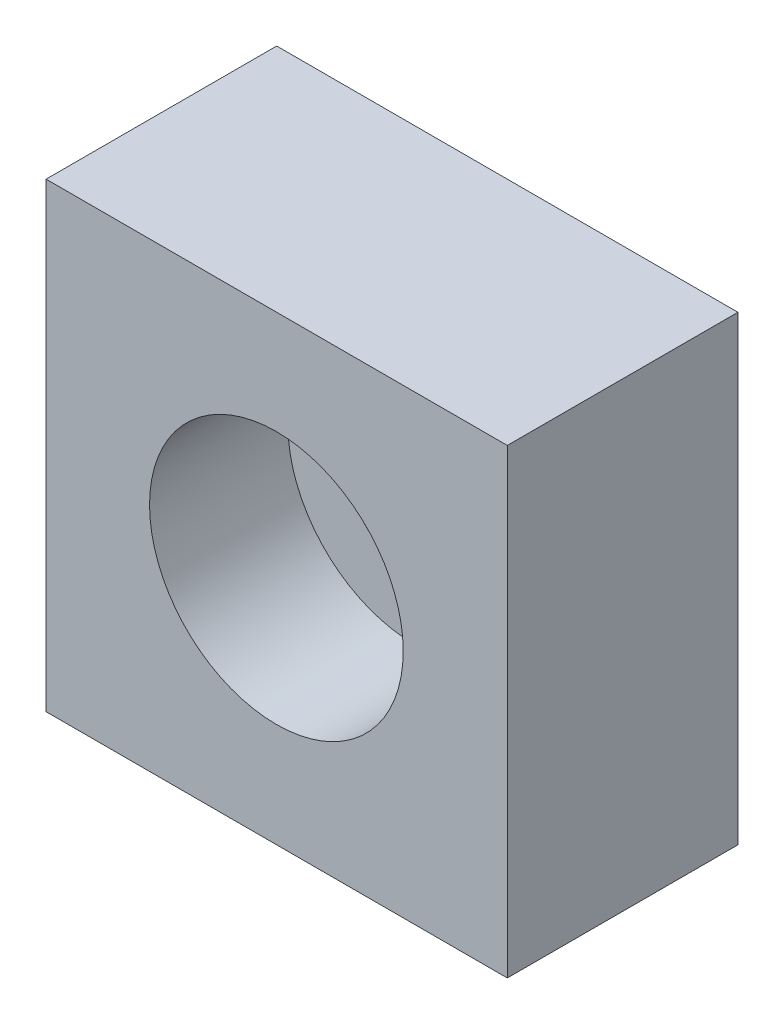
ISO-10303-21;
HEADER;
FILE_DESCRIPTION(('STEP AP214'),'2;1');
FILE_NAME('part.step','',(''),(''),'','','');
FILE_SCHEMA(('AUTOMOTIVE_DESIGN { 1 0 10303 214 1 1 1 1 }'));
ENDSEC;
DATA;
#1=APPLICATION_CONTEXT('core data for automotive mechanical design processes');
#2=APPLICATION_PROTOCOL_DEFINITION('international standard','automotive_design',2000,#1);
#3=PRODUCT_CONTEXT('',#1,'mechanical');
#4=PRODUCT('Part','Part','',(#3));
#5=PRODUCT_RELATED_PRODUCT_CATEGORY('part','',(#4));
#6=PRODUCT_DEFINITION_FORMATION('','',#4);
#7=PRODUCT_DEFINITION_CONTEXT('part definition',#1,'design');
#8=PRODUCT_DEFINITION('design','',#6,#7);
#9=PRODUCT_DEFINITION_SHAPE('','',#8);
#10=(LENGTH_UNIT() NAMED_UNIT(*) SI_UNIT(.MILLI.,.METRE.));
#11=(NAMED_UNIT(*) PLANE_ANGLE_UNIT() SI_UNIT($,.RADIAN.));
#12=(NAMED_UNIT(*) SI_UNIT($,.STERADIAN.) SOLID_ANGLE_UNIT());
#13=UNCERTAINTY_MEASURE_WITH_UNIT(LENGTH_MEASURE(1.E-05),#10,'distance_accuracy_value','');
#14=(GEOMETRIC_REPRESENTATION_CONTEXT(3) GLOBAL_UNCERTAINTY_ASSIGNED_CONTEXT((#13)) GLOBAL_UNIT_ASSIGNED_CONTEXT((#10,
#11,#12)) REPRESENTATION_CONTEXT('',''));
#15=CARTESIAN_POINT('',(0.,0.,0.));
#16=DIRECTION('',(0.,0.,1.));
#17=DIRECTION('',(1.,0.,0.));
#18=AXIS2_PLACEMENT_3D('',#15,#16,#17);
#19=CARTESIAN_POINT('',(0.,0.,10.));
#20=DIRECTION('',(1.,0.,0.));
#21=DIRECTION('',(0.,0.,-1.));
#22=AXIS2_PLACEMENT_3D('',#19,#20,#21);
#23=PLANE('',#22);
#24=DIRECTION('',(0.,-1.,0.));
#25=VECTOR('',#24,1.);
#26=CARTESIAN_POINT('',(0.,0.,0.));
#27=LINE('',#26,#25);
#28=CARTESIAN_POINT('',(0.,20.,0.));
#29=VERTEX_POINT('',#28);
#30=CARTESIAN_POINT('',(0.,0.,0.));
#31=VERTEX_POINT('',#30);
#32=EDGE_CURVE('E105',#29,#31,#27,.T.);
#33=ORIENTED_EDGE('',*,*,#32,.T.);
#34=DIRECTION('',(0.,0.,-1.));
#35=VECTOR('',#34,1.);
#36=CARTESIAN_POINT('',(0.,0.,10.));
#37=LINE('',#36,#35);
#38=CARTESIAN_POINT('',(0.,0.,10.));
#39=VERTEX_POINT('',#38);
#40=EDGE_CURVE('E11',#39,#31,#37,.T.);
#41=ORIENTED_EDGE('',*,*,#40,.F.);
#42=DIRECTION('',(0.,-1.,0.));
#43=VECTOR('',#42,1.);
#44=CARTESIAN_POINT('',(0.,0.,10.));
#45=LINE('',#44,#43);
#46=CARTESIAN_POINT('',(0.,20.,10.));
#47=VERTEX_POINT('',#46);
#48=EDGE_CURVE('E89',#47,#39,#45,.T.);
#49=ORIENTED_EDGE('',*,*,#48,.F.);
#50=DIRECTION('',(0.,0.,-1.));
#51=VECTOR('',#50,1.);
#52=CARTESIAN_POINT('',(0.,20.,10.));
#53=LINE('',#52,#51);
#54=EDGE_CURVE('E98',#47,#29,#53,.T.);
#55=ORIENTED_EDGE('',*,*,#54,.T.);
#56=EDGE_LOOP('',(#33,#41,#49,#55));
#57=FACE_BOUND('',#56,.T.);
#58=ADVANCED_FACE('F39',(#57),#23,.F.);
#59=CARTESIAN_POINT('',(0.,0.,10.));
#60=DIRECTION('',(0.,1.,0.));
#61=DIRECTION('',(0.,0.,1.));
#62=AXIS2_PLACEMENT_3D('',#59,#60,#61);
#63=PLANE('',#62);
#64=DIRECTION('',(1.,0.,0.));
#65=VECTOR('',#64,1.);
#66=CARTESIAN_POINT('',(0.,0.,0.));
#67=LINE('',#66,#65);
#68=CARTESIAN_POINT('',(20.,0.,0.));
#69=VERTEX_POINT('',#68);
#70=EDGE_CURVE('E94',#31,#69,#67,.T.);
#71=ORIENTED_EDGE('',*,*,#70,.T.);
#72=DIRECTION('',(0.,0.,-1.));
#73=VECTOR('',#72,1.);
#74=CARTESIAN_POINT('',(20.,0.,10.));
#75=LINE('',#74,#73);
#76=CARTESIAN_POINT('',(20.,0.,10.));
#77=VERTEX_POINT('',#76);
#78=EDGE_CURVE('E50',#77,#69,#75,.T.);
#79=ORIENTED_EDGE('',*,*,#78,.F.);
#80=DIRECTION('',(1.,0.,0.));
#81=VECTOR('',#80,1.);
#82=CARTESIAN_POINT('',(0.,0.,10.));
#83=LINE('',#82,#81);
#84=EDGE_CURVE('E84',#39,#77,#83,.T.);
#85=ORIENTED_EDGE('',*,*,#84,.F.);
#86=ORIENTED_EDGE('',*,*,#40,.T.);
#87=EDGE_LOOP('',(#71,#79,#85,#86));
#88=FACE_BOUND('',#87,.T.);
#89=ADVANCED_FACE('F91',(#88),#63,.F.);
#90=CARTESIAN_POINT('',(20.,0.,10.));
#91=DIRECTION('',(-1.,0.,0.));
#92=DIRECTION('',(0.,0.,1.));
#93=AXIS2_PLACEMENT_3D('',#90,#91,#92);
#94=PLANE('',#93);
#95=DIRECTION('',(0.,1.,0.));
#96=VECTOR('',#95,1.);
#97=CARTESIAN_POINT('',(20.,0.,0.));
#98=LINE('',#97,#96);
#99=CARTESIAN_POINT('',(20.,20.,0.));
#100=VERTEX_POINT('',#99);
#101=EDGE_CURVE('E75',#69,#100,#98,.T.);
#102=ORIENTED_EDGE('',*,*,#101,.T.);
#103=DIRECTION('',(0.,0.,-1.));
#104=VECTOR('',#103,1.);
#105=CARTESIAN_POINT('',(20.,20.,10.));
#106=LINE('',#105,#104);
#107=CARTESIAN_POINT('',(20.,20.,10.));
#108=VERTEX_POINT('',#107);
#109=EDGE_CURVE('E92',#108,#100,#106,.T.);
#110=ORIENTED_EDGE('',*,*,#109,.F.);
#111=DIRECTION('',(0.,1.,0.));
#112=VECTOR('',#111,1.);
#113=CARTESIAN_POINT('',(20.,0.,10.));
#114=LINE('',#113,#112);
#115=EDGE_CURVE('E86',#77,#108,#114,.T.);
#116=ORIENTED_EDGE('',*,*,#115,.F.);
#117=ORIENTED_EDGE('',*,*,#78,.T.);
#118=EDGE_LOOP('',(#102,#110,#116,#117));
#119=FACE_BOUND('',#118,.T.);
#120=ADVANCED_FACE('F96',(#119),#94,.F.);
#121=CARTESIAN_POINT('',(0.,20.,10.));
#122=DIRECTION('',(0.,-1.,0.));
#123=DIRECTION('',(0.,0.,-1.));
#124=AXIS2_PLACEMENT_3D('',#121,#122,#123);
#125=PLANE('',#124);
#126=DIRECTION('',(-1.,0.,0.));
#127=VECTOR('',#126,1.);
#128=CARTESIAN_POINT('',(0.,20.,0.));
#129=LINE('',#128,#127);
#130=EDGE_CURVE('E79',#100,#29,#129,.T.);
#131=ORIENTED_EDGE('',*,*,#130,.T.);
#132=ORIENTED_EDGE('',*,*,#54,.F.);
#133=DIRECTION('',(-1.,0.,0.));
#134=VECTOR('',#133,1.);
#135=CARTESIAN_POINT('',(0.,20.,10.));
#136=LINE('',#135,#134);
#137=EDGE_CURVE('E54',#108,#47,#136,.T.);
#138=ORIENTED_EDGE('',*,*,#137,.F.);
#139=ORIENTED_EDGE('',*,*,#109,.T.);
#140=EDGE_LOOP('',(#131,#132,#138,#139));
#141=FACE_BOUND('',#140,.T.);
#142=ADVANCED_FACE('F109',(#141),#125,.F.);
#143=CARTESIAN_POINT('',(0.,0.,10.));
#144=DIRECTION('',(0.,0.,-1.));
#145=DIRECTION('',(-1.,0.,0.));
#146=AXIS2_PLACEMENT_3D('',#143,#144,#145);
#147=PLANE('',#146);
#148=CARTESIAN_POINT('',(9.98648737498797,10.0143055988724,10.));
#149=DIRECTION('',(0.,0.,1.));
#150=DIRECTION('',(1.,0.,0.));
#151=AXIS2_PLACEMENT_3D('',#148,#149,#150);
#152=CIRCLE('',#151,5.49999999999999);
#153=CARTESIAN_POINT('',(15.486487374988,10.0143055988724,10.));
#154=VERTEX_POINT('',#153);
#155=EDGE_CURVE('E123',#154,#154,#152,.T.);
#156=ORIENTED_EDGE('',*,*,#155,.F.);
#157=EDGE_LOOP('',(#156));
#158=FACE_BOUND('',#157,.T.);
#159=ORIENTED_EDGE('',*,*,#48,.T.);
#160=ORIENTED_EDGE('',*,*,#84,.T.);
#161=ORIENTED_EDGE('',*,*,#115,.T.);
#162=ORIENTED_EDGE('',*,*,#137,.T.);
#163=EDGE_LOOP('',(#159,#160,#161,#162));
#164=FACE_BOUND('',#163,.T.);
#165=ADVANCED_FACE('F88',(#158,#164),#147,.F.);
#166=CARTESIAN_POINT('',(0.,0.,0.));
#167=DIRECTION('',(0.,0.,-1.));
#168=DIRECTION('',(-1.,0.,0.));
#169=AXIS2_PLACEMENT_3D('',#166,#167,#168);
#170=PLANE('',#169);
#171=CARTESIAN_POINT('',(9.98648737498797,10.0143055988724,0.));
#172=DIRECTION('',(0.,0.,1.));
#173=DIRECTION('',(1.,0.,0.));
#174=AXIS2_PLACEMENT_3D('',#171,#172,#173);
#175=CIRCLE('',#174,3.00000000000001);
#176=CARTESIAN_POINT('',(12.986487374988,10.0143055988724,0.));
#177=VERTEX_POINT('',#176);
#178=EDGE_CURVE('E104',#177,#177,#175,.T.);
#179=ORIENTED_EDGE('',*,*,#178,.T.);
#180=EDGE_LOOP('',(#179));
#181=FACE_BOUND('',#180,.T.);
#182=ORIENTED_EDGE('',*,*,#32,.F.);
#183=ORIENTED_EDGE('',*,*,#130,.F.);
#184=ORIENTED_EDGE('',*,*,#101,.F.);
#185=ORIENTED_EDGE('',*,*,#70,.F.);
#186=EDGE_LOOP('',(#182,#183,#184,#185));
#187=FACE_BOUND('',#186,.T.);
#188=ADVANCED_FACE('F114',(#181,#187),#170,.T.);
#189=CARTESIAN_POINT('',(9.98648737498797,10.0143055988724,10.));
#190=DIRECTION('',(0.,0.,1.));
#191=DIRECTION('',(1.,0.,0.));
#192=AXIS2_PLACEMENT_3D('',#189,#190,#191);
#193=CYLINDRICAL_SURFACE('',#192,3.00000000000001);
#194=ORIENTED_EDGE('',*,*,#178,.F.);
#195=EDGE_LOOP('',(#194));
#196=FACE_BOUND('',#195,.T.);
#197=CARTESIAN_POINT('',(9.98648737498797,10.0143055988724,4.));
#198=DIRECTION('',(0.,0.,1.));
#199=DIRECTION('',(1.,0.,0.));
#200=AXIS2_PLACEMENT_3D('',#197,#198,#199);
#201=CIRCLE('',#200,3.00000000000001);
#202=CARTESIAN_POINT('',(12.986487374988,10.0143055988724,4.));
#203=VERTEX_POINT('',#202);
#204=EDGE_CURVE('E119',#203,#203,#201,.T.);
#205=ORIENTED_EDGE('',*,*,#204,.T.);
#206=EDGE_LOOP('',(#205));
#207=FACE_BOUND('',#206,.T.);
#208=ADVANCED_FACE('F136',(#196,#207),#193,.F.);
#209=CARTESIAN_POINT('',(12.986487374988,10.0143055988724,4.));
#210=DIRECTION('',(0.,0.,-1.));
#211=DIRECTION('',(-1.,0.,0.));
#212=AXIS2_PLACEMENT_3D('',#209,#210,#211);
#213=PLANE('',#212);
#214=ORIENTED_EDGE('',*,*,#204,.F.);
#215=EDGE_LOOP('',(#214));
#216=FACE_BOUND('',#215,.T.);
#217=CARTESIAN_POINT('',(9.98648737498797,10.0143055988724,4.));
#218=DIRECTION('',(0.,0.,1.));
#219=DIRECTION('',(1.,0.,0.));
#220=AXIS2_PLACEMENT_3D('',#217,#218,#219);
#221=CIRCLE('',#220,5.49999999999999);
#222=CARTESIAN_POINT('',(15.486487374988,10.0143055988724,4.));
#223=VERTEX_POINT('',#222);
#224=EDGE_CURVE('E121',#223,#223,#221,.T.);
#225=ORIENTED_EDGE('',*,*,#224,.T.);
#226=EDGE_LOOP('',(#225));
#227=FACE_BOUND('',#226,.T.);
#228=ADVANCED_FACE('F176',(#216,#227),#213,.F.);
#229=CARTESIAN_POINT('',(9.98648737498797,10.0143055988724,10.));
#230=DIRECTION('',(0.,0.,1.));
#231=DIRECTION('',(1.,0.,0.));
#232=AXIS2_PLACEMENT_3D('',#229,#230,#231);
#233=CYLINDRICAL_SURFACE('',#232,5.49999999999999);
#234=ORIENTED_EDGE('',*,*,#224,.F.);
#235=EDGE_LOOP('',(#234));
#236=FACE_BOUND('',#235,.T.);
#237=ORIENTED_EDGE('',*,*,#155,.T.);
#238=EDGE_LOOP('',(#237));
#239=FACE_BOUND('',#238,.T.);
#240=ADVANCED_FACE('F126',(#236,#239),#233,.F.);
#241=CLOSED_SHELL('',(#58,#89,#120,#142,#165,#188,#208,#228,#240));
#242=MANIFOLD_SOLID_BREP('B2',#241);
#243=ADVANCED_BREP_SHAPE_REPRESENTATION('',(#18,#242),#14);
#244=SHAPE_DEFINITION_REPRESENTATION(#9,#243);
ENDSEC;
END-ISO-10303-21;
